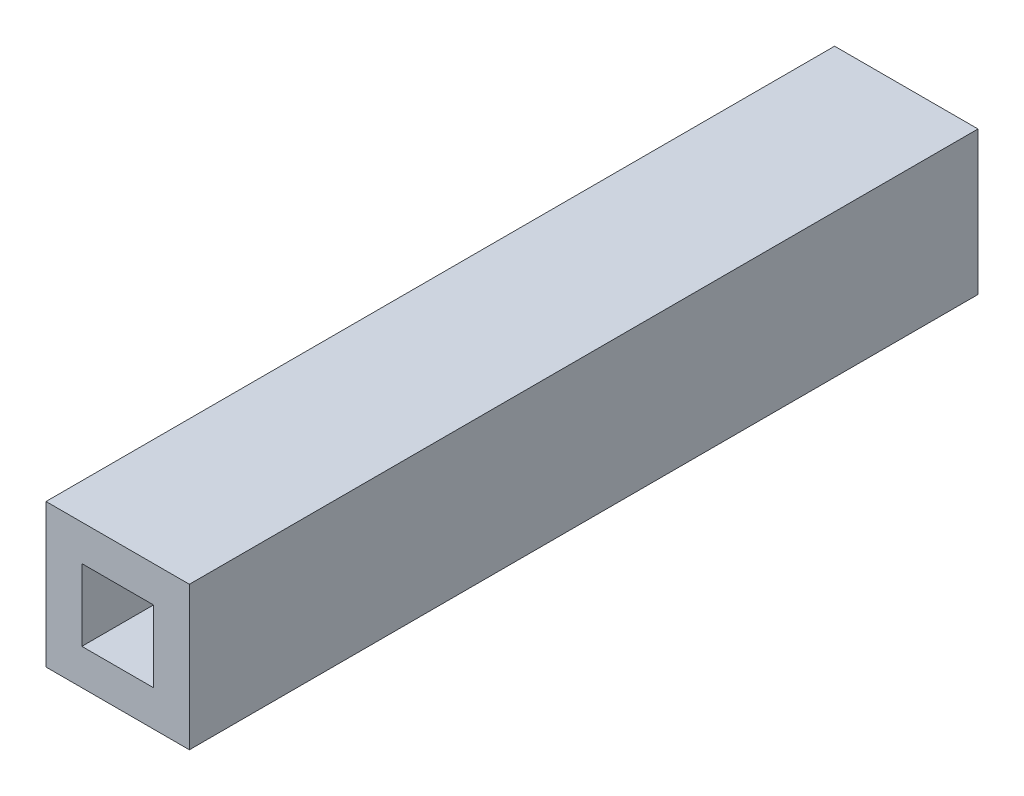
ISO-10303-21;
HEADER;
FILE_DESCRIPTION(('STEP AP214'),'2;1');
FILE_NAME('part.step','',(''),(''),'','','');
FILE_SCHEMA(('AUTOMOTIVE_DESIGN { 1 0 10303 214 1 1 1 1 }'));
ENDSEC;
DATA;
#1=APPLICATION_CONTEXT('core data for automotive mechanical design processes');
#2=APPLICATION_PROTOCOL_DEFINITION('international standard','automotive_design',2000,#1);
#3=PRODUCT_CONTEXT('',#1,'mechanical');
#4=PRODUCT('Part','Part','',(#3));
#5=PRODUCT_RELATED_PRODUCT_CATEGORY('part','',(#4));
#6=PRODUCT_DEFINITION_FORMATION('','',#4);
#7=PRODUCT_DEFINITION_CONTEXT('part definition',#1,'design');
#8=PRODUCT_DEFINITION('design','',#6,#7);
#9=PRODUCT_DEFINITION_SHAPE('','',#8);
#10=(LENGTH_UNIT() NAMED_UNIT(*) SI_UNIT(.MILLI.,.METRE.));
#11=(NAMED_UNIT(*) PLANE_ANGLE_UNIT() SI_UNIT($,.RADIAN.));
#12=(NAMED_UNIT(*) SI_UNIT($,.STERADIAN.) SOLID_ANGLE_UNIT());
#13=UNCERTAINTY_MEASURE_WITH_UNIT(LENGTH_MEASURE(1.E-05),#10,'distance_accuracy_value','');
#14=(GEOMETRIC_REPRESENTATION_CONTEXT(3) GLOBAL_UNCERTAINTY_ASSIGNED_CONTEXT((#13)) GLOBAL_UNIT_ASSIGNED_CONTEXT((#10,
#11,#12)) REPRESENTATION_CONTEXT('',''));
#15=CARTESIAN_POINT('',(0.,0.,0.));
#16=DIRECTION('',(0.,0.,1.));
#17=DIRECTION('',(1.,0.,0.));
#18=AXIS2_PLACEMENT_3D('',#15,#16,#17);
#19=CARTESIAN_POINT('',(0.,0.,110.));
#20=DIRECTION('',(0.,0.,1.));
#21=DIRECTION('',(1.,0.,0.));
#22=AXIS2_PLACEMENT_3D('',#19,#20,#21);
#23=PLANE('',#22);
#24=DIRECTION('',(0.,1.,0.));
#25=VECTOR('',#24,1.);
#26=CARTESIAN_POINT('',(10.,-10.,110.));
#27=LINE('',#26,#25);
#28=CARTESIAN_POINT('',(10.,-10.,110.));
#29=VERTEX_POINT('',#28);
#30=CARTESIAN_POINT('',(10.,10.,110.));
#31=VERTEX_POINT('',#30);
#32=EDGE_CURVE('E158',#29,#31,#27,.T.);
#33=ORIENTED_EDGE('',*,*,#32,.T.);
#34=DIRECTION('',(-1.,0.,0.));
#35=VECTOR('',#34,1.);
#36=CARTESIAN_POINT('',(-10.,10.,110.));
#37=LINE('',#36,#35);
#38=CARTESIAN_POINT('',(-10.,10.,110.));
#39=VERTEX_POINT('',#38);
#40=EDGE_CURVE('E161',#31,#39,#37,.T.);
#41=ORIENTED_EDGE('',*,*,#40,.T.);
#42=DIRECTION('',(0.,-1.,0.));
#43=VECTOR('',#42,1.);
#44=CARTESIAN_POINT('',(-10.,-10.,110.));
#45=LINE('',#44,#43);
#46=CARTESIAN_POINT('',(-10.,-10.,110.));
#47=VERTEX_POINT('',#46);
#48=EDGE_CURVE('E164',#39,#47,#45,.T.);
#49=ORIENTED_EDGE('',*,*,#48,.T.);
#50=DIRECTION('',(1.,0.,0.));
#51=VECTOR('',#50,1.);
#52=CARTESIAN_POINT('',(-10.,-10.,110.));
#53=LINE('',#52,#51);
#54=EDGE_CURVE('E166',#47,#29,#53,.T.);
#55=ORIENTED_EDGE('',*,*,#54,.T.);
#56=EDGE_LOOP('',(#33,#41,#49,#55));
#57=FACE_BOUND('',#56,.T.);
#58=DIRECTION('',(-1.,0.,0.));
#59=VECTOR('',#58,1.);
#60=CARTESIAN_POINT('',(0.,5.,110.));
#61=LINE('',#60,#59);
#62=CARTESIAN_POINT('',(5.,5.,110.));
#63=VERTEX_POINT('',#62);
#64=CARTESIAN_POINT('',(-5.,5.,110.));
#65=VERTEX_POINT('',#64);
#66=EDGE_CURVE('E130',#63,#65,#61,.T.);
#67=ORIENTED_EDGE('',*,*,#66,.F.);
#68=DIRECTION('',(0.,1.,0.));
#69=VECTOR('',#68,1.);
#70=CARTESIAN_POINT('',(5.,0.,110.));
#71=LINE('',#70,#69);
#72=CARTESIAN_POINT('',(5.,-5.,110.));
#73=VERTEX_POINT('',#72);
#74=EDGE_CURVE('E122',#73,#63,#71,.T.);
#75=ORIENTED_EDGE('',*,*,#74,.F.);
#76=DIRECTION('',(1.,0.,0.));
#77=VECTOR('',#76,1.);
#78=CARTESIAN_POINT('',(0.,-5.,110.));
#79=LINE('',#78,#77);
#80=CARTESIAN_POINT('',(-5.,-5.,110.));
#81=VERTEX_POINT('',#80);
#82=EDGE_CURVE('E144',#81,#73,#79,.T.);
#83=ORIENTED_EDGE('',*,*,#82,.F.);
#84=DIRECTION('',(0.,-1.,0.));
#85=VECTOR('',#84,1.);
#86=CARTESIAN_POINT('',(-5.,0.,110.));
#87=LINE('',#86,#85);
#88=EDGE_CURVE('E142',#65,#81,#87,.T.);
#89=ORIENTED_EDGE('',*,*,#88,.F.);
#90=EDGE_LOOP('',(#67,#75,#83,#89));
#91=FACE_BOUND('',#90,.T.);
#92=ADVANCED_FACE('F57',(#57,#91),#23,.T.);
#93=CARTESIAN_POINT('',(0.,0.,0.));
#94=DIRECTION('',(0.,0.,1.));
#95=DIRECTION('',(1.,0.,0.));
#96=AXIS2_PLACEMENT_3D('',#93,#94,#95);
#97=PLANE('',#96);
#98=DIRECTION('',(0.,1.,0.));
#99=VECTOR('',#98,1.);
#100=CARTESIAN_POINT('',(10.,-10.,0.));
#101=LINE('',#100,#99);
#102=CARTESIAN_POINT('',(10.,-10.,0.));
#103=VERTEX_POINT('',#102);
#104=CARTESIAN_POINT('',(10.,10.,0.));
#105=VERTEX_POINT('',#104);
#106=EDGE_CURVE('E138',#103,#105,#101,.T.);
#107=ORIENTED_EDGE('',*,*,#106,.F.);
#108=DIRECTION('',(1.,0.,0.));
#109=VECTOR('',#108,1.);
#110=CARTESIAN_POINT('',(-10.,-10.,0.));
#111=LINE('',#110,#109);
#112=CARTESIAN_POINT('',(-10.,-10.,0.));
#113=VERTEX_POINT('',#112);
#114=EDGE_CURVE('E162',#113,#103,#111,.T.);
#115=ORIENTED_EDGE('',*,*,#114,.F.);
#116=DIRECTION('',(0.,-1.,0.));
#117=VECTOR('',#116,1.);
#118=CARTESIAN_POINT('',(-10.,-10.,0.));
#119=LINE('',#118,#117);
#120=CARTESIAN_POINT('',(-10.,10.,0.));
#121=VERTEX_POINT('',#120);
#122=EDGE_CURVE('E173',#121,#113,#119,.T.);
#123=ORIENTED_EDGE('',*,*,#122,.F.);
#124=DIRECTION('',(-1.,0.,0.));
#125=VECTOR('',#124,1.);
#126=CARTESIAN_POINT('',(-10.,10.,0.));
#127=LINE('',#126,#125);
#128=EDGE_CURVE('E171',#105,#121,#127,.T.);
#129=ORIENTED_EDGE('',*,*,#128,.F.);
#130=EDGE_LOOP('',(#107,#115,#123,#129));
#131=FACE_BOUND('',#130,.T.);
#132=DIRECTION('',(0.,1.,0.));
#133=VECTOR('',#132,1.);
#134=CARTESIAN_POINT('',(5.,0.,0.));
#135=LINE('',#134,#133);
#136=CARTESIAN_POINT('',(5.,-5.,0.));
#137=VERTEX_POINT('',#136);
#138=CARTESIAN_POINT('',(5.,5.,0.));
#139=VERTEX_POINT('',#138);
#140=EDGE_CURVE('E80',#137,#139,#135,.T.);
#141=ORIENTED_EDGE('',*,*,#140,.T.);
#142=DIRECTION('',(-1.,0.,0.));
#143=VECTOR('',#142,1.);
#144=CARTESIAN_POINT('',(0.,5.,0.));
#145=LINE('',#144,#143);
#146=CARTESIAN_POINT('',(-5.,5.,0.));
#147=VERTEX_POINT('',#146);
#148=EDGE_CURVE('E137',#139,#147,#145,.T.);
#149=ORIENTED_EDGE('',*,*,#148,.T.);
#150=DIRECTION('',(0.,-1.,0.));
#151=VECTOR('',#150,1.);
#152=CARTESIAN_POINT('',(-5.,0.,0.));
#153=LINE('',#152,#151);
#154=CARTESIAN_POINT('',(-5.,-5.,0.));
#155=VERTEX_POINT('',#154);
#156=EDGE_CURVE('E150',#147,#155,#153,.T.);
#157=ORIENTED_EDGE('',*,*,#156,.T.);
#158=DIRECTION('',(1.,0.,0.));
#159=VECTOR('',#158,1.);
#160=CARTESIAN_POINT('',(0.,-5.,0.));
#161=LINE('',#160,#159);
#162=EDGE_CURVE('E131',#155,#137,#161,.T.);
#163=ORIENTED_EDGE('',*,*,#162,.T.);
#164=EDGE_LOOP('',(#141,#149,#157,#163));
#165=FACE_BOUND('',#164,.T.);
#166=ADVANCED_FACE('F191',(#131,#165),#97,.F.);
#167=CARTESIAN_POINT('',(10.,-10.,110.));
#168=DIRECTION('',(-1.,0.,0.));
#169=DIRECTION('',(0.,0.,1.));
#170=AXIS2_PLACEMENT_3D('',#167,#168,#169);
#171=PLANE('',#170);
#172=ORIENTED_EDGE('',*,*,#106,.T.);
#173=DIRECTION('',(0.,0.,-1.));
#174=VECTOR('',#173,1.);
#175=CARTESIAN_POINT('',(10.,10.,110.));
#176=LINE('',#175,#174);
#177=EDGE_CURVE('E12',#31,#105,#176,.T.);
#178=ORIENTED_EDGE('',*,*,#177,.F.);
#179=ORIENTED_EDGE('',*,*,#32,.F.);
#180=DIRECTION('',(0.,0.,-1.));
#181=VECTOR('',#180,1.);
#182=CARTESIAN_POINT('',(10.,-10.,110.));
#183=LINE('',#182,#181);
#184=EDGE_CURVE('E168',#29,#103,#183,.T.);
#185=ORIENTED_EDGE('',*,*,#184,.T.);
#186=EDGE_LOOP('',(#172,#178,#179,#185));
#187=FACE_BOUND('',#186,.T.);
#188=ADVANCED_FACE('F59',(#187),#171,.F.);
#189=CARTESIAN_POINT('',(-10.,10.,110.));
#190=DIRECTION('',(0.,-1.,0.));
#191=DIRECTION('',(0.,0.,-1.));
#192=AXIS2_PLACEMENT_3D('',#189,#190,#191);
#193=PLANE('',#192);
#194=ORIENTED_EDGE('',*,*,#128,.T.);
#195=DIRECTION('',(0.,0.,-1.));
#196=VECTOR('',#195,1.);
#197=CARTESIAN_POINT('',(-10.,10.,110.));
#198=LINE('',#197,#196);
#199=EDGE_CURVE('E65',#39,#121,#198,.T.);
#200=ORIENTED_EDGE('',*,*,#199,.F.);
#201=ORIENTED_EDGE('',*,*,#40,.F.);
#202=ORIENTED_EDGE('',*,*,#177,.T.);
#203=EDGE_LOOP('',(#194,#200,#201,#202));
#204=FACE_BOUND('',#203,.T.);
#205=ADVANCED_FACE('F201',(#204),#193,.F.);
#206=CARTESIAN_POINT('',(-10.,-10.,110.));
#207=DIRECTION('',(1.,0.,0.));
#208=DIRECTION('',(0.,0.,-1.));
#209=AXIS2_PLACEMENT_3D('',#206,#207,#208);
#210=PLANE('',#209);
#211=ORIENTED_EDGE('',*,*,#122,.T.);
#212=DIRECTION('',(0.,0.,-1.));
#213=VECTOR('',#212,1.);
#214=CARTESIAN_POINT('',(-10.,-10.,110.));
#215=LINE('',#214,#213);
#216=EDGE_CURVE('E178',#47,#113,#215,.T.);
#217=ORIENTED_EDGE('',*,*,#216,.F.);
#218=ORIENTED_EDGE('',*,*,#48,.F.);
#219=ORIENTED_EDGE('',*,*,#199,.T.);
#220=EDGE_LOOP('',(#211,#217,#218,#219));
#221=FACE_BOUND('',#220,.T.);
#222=ADVANCED_FACE('F185',(#221),#210,.F.);
#223=CARTESIAN_POINT('',(-10.,-10.,110.));
#224=DIRECTION('',(0.,1.,0.));
#225=DIRECTION('',(0.,0.,1.));
#226=AXIS2_PLACEMENT_3D('',#223,#224,#225);
#227=PLANE('',#226);
#228=ORIENTED_EDGE('',*,*,#114,.T.);
#229=ORIENTED_EDGE('',*,*,#184,.F.);
#230=ORIENTED_EDGE('',*,*,#54,.F.);
#231=ORIENTED_EDGE('',*,*,#216,.T.);
#232=EDGE_LOOP('',(#228,#229,#230,#231));
#233=FACE_BOUND('',#232,.T.);
#234=ADVANCED_FACE('F195',(#233),#227,.F.);
#235=CARTESIAN_POINT('',(5.,0.,110.));
#236=DIRECTION('',(-1.,0.,0.));
#237=DIRECTION('',(0.,0.,1.));
#238=AXIS2_PLACEMENT_3D('',#235,#236,#237);
#239=PLANE('',#238);
#240=ORIENTED_EDGE('',*,*,#140,.F.);
#241=DIRECTION('',(0.,0.,-1.));
#242=VECTOR('',#241,1.);
#243=CARTESIAN_POINT('',(5.,-5.,110.));
#244=LINE('',#243,#242);
#245=EDGE_CURVE('E126',#73,#137,#244,.T.);
#246=ORIENTED_EDGE('',*,*,#245,.F.);
#247=ORIENTED_EDGE('',*,*,#74,.T.);
#248=DIRECTION('',(0.,0.,-1.));
#249=VECTOR('',#248,1.);
#250=CARTESIAN_POINT('',(5.,5.,110.));
#251=LINE('',#250,#249);
#252=EDGE_CURVE('E125',#63,#139,#251,.T.);
#253=ORIENTED_EDGE('',*,*,#252,.T.);
#254=EDGE_LOOP('',(#240,#246,#247,#253));
#255=FACE_BOUND('',#254,.T.);
#256=ADVANCED_FACE('F124',(#255),#239,.T.);
#257=CARTESIAN_POINT('',(0.,5.,110.));
#258=DIRECTION('',(0.,-1.,0.));
#259=DIRECTION('',(0.,0.,-1.));
#260=AXIS2_PLACEMENT_3D('',#257,#258,#259);
#261=PLANE('',#260);
#262=ORIENTED_EDGE('',*,*,#148,.F.);
#263=ORIENTED_EDGE('',*,*,#252,.F.);
#264=ORIENTED_EDGE('',*,*,#66,.T.);
#265=DIRECTION('',(0.,0.,-1.));
#266=VECTOR('',#265,1.);
#267=CARTESIAN_POINT('',(-5.,5.,110.));
#268=LINE('',#267,#266);
#269=EDGE_CURVE('E139',#65,#147,#268,.T.);
#270=ORIENTED_EDGE('',*,*,#269,.T.);
#271=EDGE_LOOP('',(#262,#263,#264,#270));
#272=FACE_BOUND('',#271,.T.);
#273=ADVANCED_FACE('F134',(#272),#261,.T.);
#274=CARTESIAN_POINT('',(-5.,0.,110.));
#275=DIRECTION('',(1.,0.,0.));
#276=DIRECTION('',(0.,0.,-1.));
#277=AXIS2_PLACEMENT_3D('',#274,#275,#276);
#278=PLANE('',#277);
#279=ORIENTED_EDGE('',*,*,#156,.F.);
#280=ORIENTED_EDGE('',*,*,#269,.F.);
#281=ORIENTED_EDGE('',*,*,#88,.T.);
#282=DIRECTION('',(0.,0.,-1.));
#283=VECTOR('',#282,1.);
#284=CARTESIAN_POINT('',(-5.,-5.,110.));
#285=LINE('',#284,#283);
#286=EDGE_CURVE('E72',#81,#155,#285,.T.);
#287=ORIENTED_EDGE('',*,*,#286,.T.);
#288=EDGE_LOOP('',(#279,#280,#281,#287));
#289=FACE_BOUND('',#288,.T.);
#290=ADVANCED_FACE('F224',(#289),#278,.T.);
#291=CARTESIAN_POINT('',(0.,-5.,110.));
#292=DIRECTION('',(0.,1.,0.));
#293=DIRECTION('',(0.,0.,1.));
#294=AXIS2_PLACEMENT_3D('',#291,#292,#293);
#295=PLANE('',#294);
#296=ORIENTED_EDGE('',*,*,#162,.F.);
#297=ORIENTED_EDGE('',*,*,#286,.F.);
#298=ORIENTED_EDGE('',*,*,#82,.T.);
#299=ORIENTED_EDGE('',*,*,#245,.T.);
#300=EDGE_LOOP('',(#296,#297,#298,#299));
#301=FACE_BOUND('',#300,.T.);
#302=ADVANCED_FACE('F228',(#301),#295,.T.);
#303=CLOSED_SHELL('',(#92,#166,#188,#205,#222,#234,#256,#273,#290,#302));
#304=MANIFOLD_SOLID_BREP('B2',#303);
#305=ADVANCED_BREP_SHAPE_REPRESENTATION('',(#18,#304),#14);
#306=SHAPE_DEFINITION_REPRESENTATION(#9,#305);
ENDSEC;
END-ISO-10303-21;
